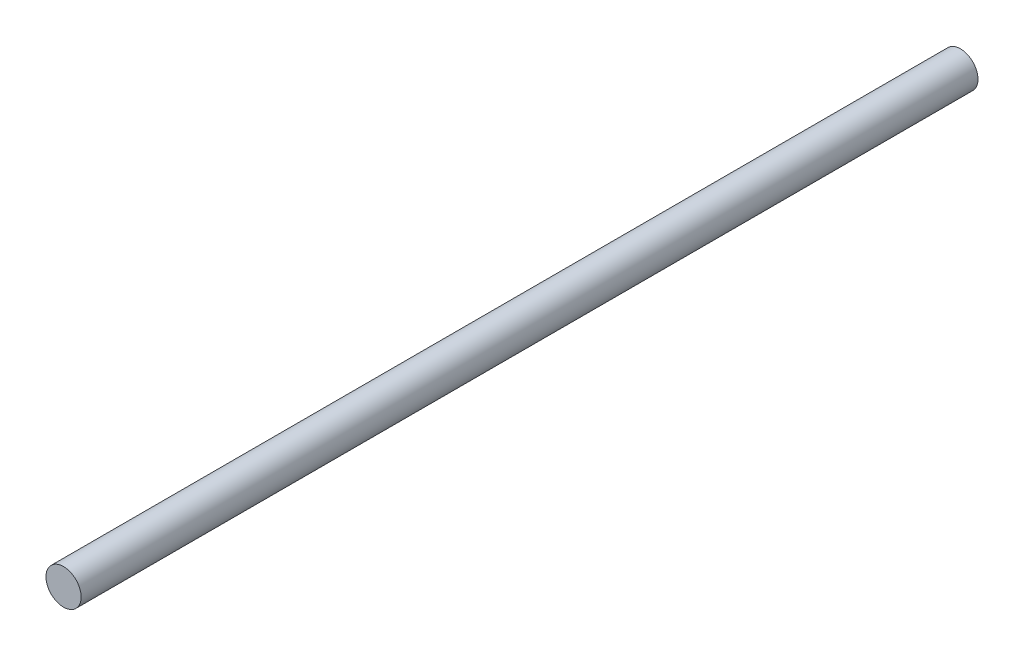
ISO-10303-21;
HEADER;
FILE_DESCRIPTION(('STEP AP214'),'2;1');
FILE_NAME('part.step','',(''),(''),'','','');
FILE_SCHEMA(('AUTOMOTIVE_DESIGN { 1 0 10303 214 1 1 1 1 }'));
ENDSEC;
DATA;
#1=APPLICATION_CONTEXT('core data for automotive mechanical design processes');
#2=APPLICATION_PROTOCOL_DEFINITION('international standard','automotive_design',2000,#1);
#3=PRODUCT_CONTEXT('',#1,'mechanical');
#4=PRODUCT('Part','Part','',(#3));
#5=PRODUCT_RELATED_PRODUCT_CATEGORY('part','',(#4));
#6=PRODUCT_DEFINITION_FORMATION('','',#4);
#7=PRODUCT_DEFINITION_CONTEXT('part definition',#1,'design');
#8=PRODUCT_DEFINITION('design','',#6,#7);
#9=PRODUCT_DEFINITION_SHAPE('','',#8);
#10=(LENGTH_UNIT() NAMED_UNIT(*) SI_UNIT(.MILLI.,.METRE.));
#11=(NAMED_UNIT(*) PLANE_ANGLE_UNIT() SI_UNIT($,.RADIAN.));
#12=(NAMED_UNIT(*) SI_UNIT($,.STERADIAN.) SOLID_ANGLE_UNIT());
#13=UNCERTAINTY_MEASURE_WITH_UNIT(LENGTH_MEASURE(1.E-05),#10,'distance_accuracy_value','');
#14=(GEOMETRIC_REPRESENTATION_CONTEXT(3) GLOBAL_UNCERTAINTY_ASSIGNED_CONTEXT((#13)) GLOBAL_UNIT_ASSIGNED_CONTEXT((#10,
#11,#12)) REPRESENTATION_CONTEXT('',''));
#15=CARTESIAN_POINT('',(0.,0.,0.));
#16=DIRECTION('',(0.,0.,1.));
#17=DIRECTION('',(1.,0.,0.));
#18=AXIS2_PLACEMENT_3D('',#15,#16,#17);
#19=CARTESIAN_POINT('',(0.,0.,255.));
#20=DIRECTION('',(0.,0.,-1.));
#21=DIRECTION('',(-1.,0.,0.));
#22=AXIS2_PLACEMENT_3D('',#19,#20,#21);
#23=CYLINDRICAL_SURFACE('',#22,5.);
#24=CARTESIAN_POINT('',(0.,0.,255.));
#25=DIRECTION('',(0.,0.,1.));
#26=DIRECTION('',(1.,0.,0.));
#27=AXIS2_PLACEMENT_3D('',#24,#25,#26);
#28=CIRCLE('',#27,5.);
#29=CARTESIAN_POINT('',(5.,0.,255.));
#30=VERTEX_POINT('',#29);
#31=EDGE_CURVE('E10',#30,#30,#28,.T.);
#32=ORIENTED_EDGE('',*,*,#31,.F.);
#33=EDGE_LOOP('',(#32));
#34=FACE_BOUND('',#33,.T.);
#35=CARTESIAN_POINT('',(0.,0.,0.));
#36=DIRECTION('',(0.,0.,1.));
#37=DIRECTION('',(1.,0.,0.));
#38=AXIS2_PLACEMENT_3D('',#35,#36,#37);
#39=CIRCLE('',#38,5.);
#40=CARTESIAN_POINT('',(5.,0.,0.));
#41=VERTEX_POINT('',#40);
#42=EDGE_CURVE('E40',#41,#41,#39,.T.);
#43=ORIENTED_EDGE('',*,*,#42,.T.);
#44=EDGE_LOOP('',(#43));
#45=FACE_BOUND('',#44,.T.);
#46=ADVANCED_FACE('F37',(#34,#45),#23,.T.);
#47=CARTESIAN_POINT('',(0.,0.,255.));
#48=DIRECTION('',(0.,0.,1.));
#49=DIRECTION('',(1.,0.,0.));
#50=AXIS2_PLACEMENT_3D('',#47,#48,#49);
#51=PLANE('',#50);
#52=ORIENTED_EDGE('',*,*,#31,.T.);
#53=EDGE_LOOP('',(#52));
#54=FACE_BOUND('',#53,.T.);
#55=ADVANCED_FACE('F54',(#54),#51,.T.);
#56=CARTESIAN_POINT('',(0.,0.,0.));
#57=DIRECTION('',(0.,0.,1.));
#58=DIRECTION('',(1.,0.,0.));
#59=AXIS2_PLACEMENT_3D('',#56,#57,#58);
#60=PLANE('',#59);
#61=ORIENTED_EDGE('',*,*,#42,.F.);
#62=EDGE_LOOP('',(#61));
#63=FACE_BOUND('',#62,.T.);
#64=ADVANCED_FACE('F52',(#63),#60,.F.);
#65=CLOSED_SHELL('',(#46,#55,#64));
#66=MANIFOLD_SOLID_BREP('B2',#65);
#67=ADVANCED_BREP_SHAPE_REPRESENTATION('',(#18,#66),#14);
#68=SHAPE_DEFINITION_REPRESENTATION(#9,#67);
ENDSEC;
END-ISO-10303-21;
